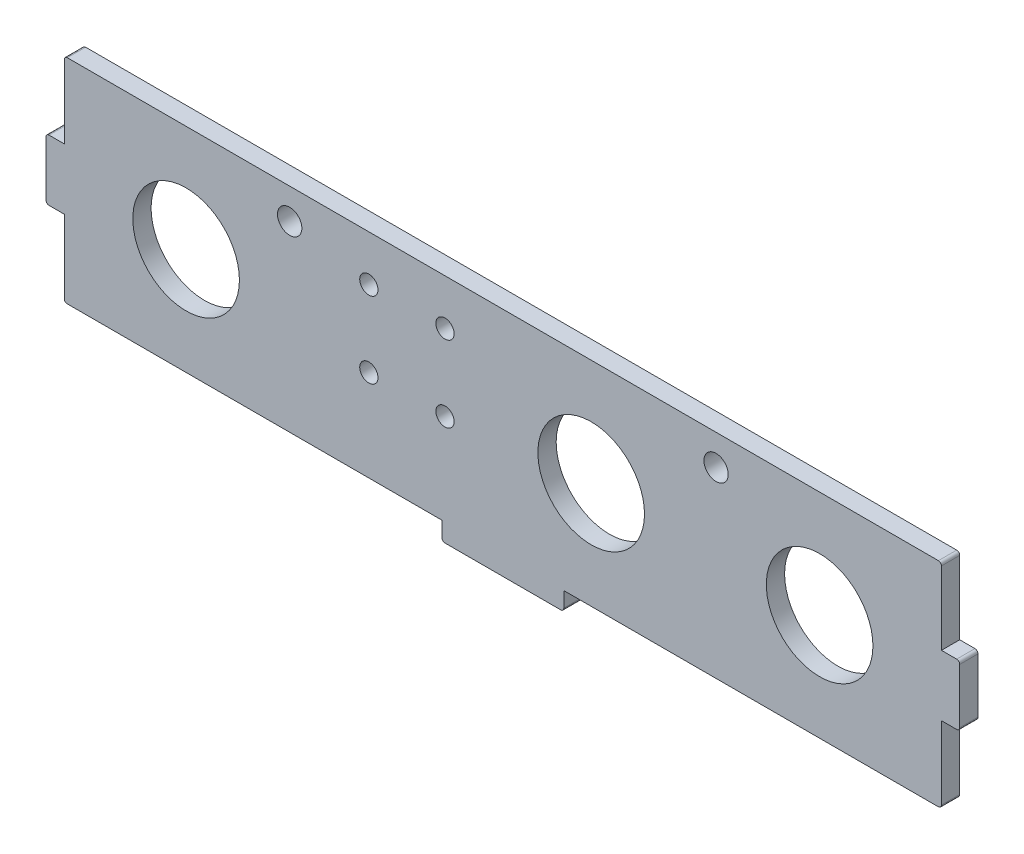
ISO-10303-21;
HEADER;
FILE_DESCRIPTION(('STEP AP214'),'2;1');
FILE_NAME('part.step','',(''),(''),'','','');
FILE_SCHEMA(('AUTOMOTIVE_DESIGN { 1 0 10303 214 1 1 1 1 }'));
ENDSEC;
DATA;
#1=APPLICATION_CONTEXT('core data for automotive mechanical design processes');
#2=APPLICATION_PROTOCOL_DEFINITION('international standard','automotive_design',2000,#1);
#3=PRODUCT_CONTEXT('',#1,'mechanical');
#4=PRODUCT('Part','Part','',(#3));
#5=PRODUCT_RELATED_PRODUCT_CATEGORY('part','',(#4));
#6=PRODUCT_DEFINITION_FORMATION('','',#4);
#7=PRODUCT_DEFINITION_CONTEXT('part definition',#1,'design');
#8=PRODUCT_DEFINITION('design','',#6,#7);
#9=PRODUCT_DEFINITION_SHAPE('','',#8);
#10=(LENGTH_UNIT() NAMED_UNIT(*) SI_UNIT(.MILLI.,.METRE.));
#11=(NAMED_UNIT(*) PLANE_ANGLE_UNIT() SI_UNIT($,.RADIAN.));
#12=(NAMED_UNIT(*) SI_UNIT($,.STERADIAN.) SOLID_ANGLE_UNIT());
#13=UNCERTAINTY_MEASURE_WITH_UNIT(LENGTH_MEASURE(1.E-05),#10,'distance_accuracy_value','');
#14=(GEOMETRIC_REPRESENTATION_CONTEXT(3) GLOBAL_UNCERTAINTY_ASSIGNED_CONTEXT((#13)) GLOBAL_UNIT_ASSIGNED_CONTEXT((#10,
#11,#12)) REPRESENTATION_CONTEXT('',''));
#15=CARTESIAN_POINT('',(0.,0.,0.));
#16=DIRECTION('',(0.,0.,1.));
#17=DIRECTION('',(1.,0.,0.));
#18=AXIS2_PLACEMENT_3D('',#15,#16,#17);
#19=CARTESIAN_POINT('',(0.,0.,-6.));
#20=DIRECTION('',(0.,-1.,0.));
#21=DIRECTION('',(0.,0.,-1.));
#22=AXIS2_PLACEMENT_3D('',#19,#20,#21);
#23=PLANE('',#22);
#24=DIRECTION('',(1.,0.,0.));
#25=VECTOR('',#24,1.);
#26=CARTESIAN_POINT('',(0.,0.,0.));
#27=LINE('',#26,#25);
#28=CARTESIAN_POINT('',(7.00000000000002,0.,0.));
#29=VERTEX_POINT('',#28);
#30=CARTESIAN_POINT('',(130.,0.,0.));
#31=VERTEX_POINT('',#30);
#32=EDGE_CURVE('E231',#29,#31,#27,.T.);
#33=ORIENTED_EDGE('',*,*,#32,.F.);
#34=DIRECTION('',(0.,0.,1.));
#35=VECTOR('',#34,1.);
#36=CARTESIAN_POINT('',(7.00000000000002,0.,-6.));
#37=LINE('',#36,#35);
#38=CARTESIAN_POINT('',(7.00000000000002,0.,-6.));
#39=VERTEX_POINT('',#38);
#40=EDGE_CURVE('E39',#29,#39,#37,.F.);
#41=ORIENTED_EDGE('',*,*,#40,.T.);
#42=DIRECTION('',(1.,0.,0.));
#43=VECTOR('',#42,1.);
#44=CARTESIAN_POINT('',(0.,0.,-6.));
#45=LINE('',#44,#43);
#46=CARTESIAN_POINT('',(130.,0.,-6.));
#47=VERTEX_POINT('',#46);
#48=EDGE_CURVE('E272',#39,#47,#45,.T.);
#49=ORIENTED_EDGE('',*,*,#48,.T.);
#50=DIRECTION('',(0.,0.,1.));
#51=VECTOR('',#50,1.);
#52=CARTESIAN_POINT('',(130.,0.,-46.4474968323134));
#53=LINE('',#52,#51);
#54=EDGE_CURVE('E225',#47,#31,#53,.T.);
#55=ORIENTED_EDGE('',*,*,#54,.T.);
#56=EDGE_LOOP('',(#33,#41,#49,#55));
#57=FACE_BOUND('',#56,.T.);
#58=ADVANCED_FACE('F31',(#57),#23,.T.);
#59=CARTESIAN_POINT('',(0.,0.,-6.));
#60=DIRECTION('',(-1.,0.,0.));
#61=DIRECTION('',(0.,0.,1.));
#62=AXIS2_PLACEMENT_3D('',#59,#60,#61);
#63=PLANE('',#62);
#64=DIRECTION('',(0.,-1.,0.));
#65=VECTOR('',#64,1.);
#66=CARTESIAN_POINT('',(0.,0.,-6.));
#67=LINE('',#66,#65);
#68=CARTESIAN_POINT('',(0.,44.,-6.));
#69=VERTEX_POINT('',#68);
#70=CARTESIAN_POINT('',(0.,26.,-6.));
#71=VERTEX_POINT('',#70);
#72=EDGE_CURVE('E276',#69,#71,#67,.T.);
#73=ORIENTED_EDGE('',*,*,#72,.T.);
#74=DIRECTION('',(0.,0.,1.));
#75=VECTOR('',#74,1.);
#76=CARTESIAN_POINT('',(0.,26.,-6.));
#77=LINE('',#76,#75);
#78=CARTESIAN_POINT('',(0.,26.,0.));
#79=VERTEX_POINT('',#78);
#80=EDGE_CURVE('E307',#71,#79,#77,.T.);
#81=ORIENTED_EDGE('',*,*,#80,.T.);
#82=DIRECTION('',(0.,-1.,0.));
#83=VECTOR('',#82,1.);
#84=CARTESIAN_POINT('',(0.,0.,0.));
#85=LINE('',#84,#83);
#86=CARTESIAN_POINT('',(0.,44.,0.));
#87=VERTEX_POINT('',#86);
#88=EDGE_CURVE('E232',#87,#79,#85,.T.);
#89=ORIENTED_EDGE('',*,*,#88,.F.);
#90=DIRECTION('',(0.,0.,1.));
#91=VECTOR('',#90,1.);
#92=CARTESIAN_POINT('',(0.,44.,-6.));
#93=LINE('',#92,#91);
#94=EDGE_CURVE('E305',#87,#69,#93,.F.);
#95=ORIENTED_EDGE('',*,*,#94,.T.);
#96=EDGE_LOOP('',(#73,#81,#89,#95));
#97=FACE_BOUND('',#96,.T.);
#98=ADVANCED_FACE('F476',(#97),#63,.T.);
#99=CARTESIAN_POINT('',(0.,70.,-6.));
#100=DIRECTION('',(0.,0.,-1.));
#101=DIRECTION('',(-1.,0.,0.));
#102=AXIS2_PLACEMENT_3D('',#99,#100,#101);
#103=PLANE('',#102);
#104=CARTESIAN_POINT('',(254.,35.,-6.));
#105=DIRECTION('',(0.,0.,-1.));
#106=DIRECTION('',(-1.,0.,0.));
#107=AXIS2_PLACEMENT_3D('',#104,#105,#106);
#108=CIRCLE('',#107,17.5);
#109=CARTESIAN_POINT('',(236.5,35.,-6.));
#110=VERTEX_POINT('',#109);
#111=EDGE_CURVE('E601',#110,#110,#108,.F.);
#112=ORIENTED_EDGE('',*,*,#111,.T.);
#113=EDGE_LOOP('',(#112));
#114=FACE_BOUND('',#113,.T.);
#115=CARTESIAN_POINT('',(179.,35.,-6.));
#116=DIRECTION('',(0.,0.,-1.));
#117=DIRECTION('',(-1.,0.,0.));
#118=AXIS2_PLACEMENT_3D('',#115,#116,#117);
#119=CIRCLE('',#118,17.5);
#120=CARTESIAN_POINT('',(161.5,35.,-6.));
#121=VERTEX_POINT('',#120);
#122=EDGE_CURVE('E605',#121,#121,#119,.F.);
#123=ORIENTED_EDGE('',*,*,#122,.T.);
#124=EDGE_LOOP('',(#123));
#125=FACE_BOUND('',#124,.T.);
#126=CARTESIAN_POINT('',(46.,35.,-6.));
#127=DIRECTION('',(0.,0.,-1.));
#128=DIRECTION('',(-1.,0.,0.));
#129=AXIS2_PLACEMENT_3D('',#126,#127,#128);
#130=CIRCLE('',#129,17.5);
#131=CARTESIAN_POINT('',(28.5,35.,-6.));
#132=VERTEX_POINT('',#131);
#133=EDGE_CURVE('E613',#132,#132,#130,.F.);
#134=ORIENTED_EDGE('',*,*,#133,.T.);
#135=EDGE_LOOP('',(#134));
#136=FACE_BOUND('',#135,.T.);
#137=CARTESIAN_POINT('',(131.,30.,-6.));
#138=DIRECTION('',(0.,0.,-1.));
#139=DIRECTION('',(-1.,0.,0.));
#140=AXIS2_PLACEMENT_3D('',#137,#138,#139);
#141=CIRCLE('',#140,2.99999999999999);
#142=CARTESIAN_POINT('',(128.,30.,-6.));
#143=VERTEX_POINT('',#142);
#144=EDGE_CURVE('E623',#143,#143,#141,.T.);
#145=ORIENTED_EDGE('',*,*,#144,.F.);
#146=EDGE_LOOP('',(#145));
#147=FACE_BOUND('',#146,.T.);
#148=CARTESIAN_POINT('',(106.,30.,-6.));
#149=DIRECTION('',(0.,0.,-1.));
#150=DIRECTION('',(-1.,0.,0.));
#151=AXIS2_PLACEMENT_3D('',#148,#149,#150);
#152=CIRCLE('',#151,3.00000000000001);
#153=CARTESIAN_POINT('',(103.,30.,-6.));
#154=VERTEX_POINT('',#153);
#155=EDGE_CURVE('E629',#154,#154,#152,.T.);
#156=ORIENTED_EDGE('',*,*,#155,.F.);
#157=EDGE_LOOP('',(#156));
#158=FACE_BOUND('',#157,.T.);
#159=CARTESIAN_POINT('',(131.,55.,-6.));
#160=DIRECTION('',(0.,0.,-1.));
#161=DIRECTION('',(-1.,0.,0.));
#162=AXIS2_PLACEMENT_3D('',#159,#160,#161);
#163=CIRCLE('',#162,2.99999999999999);
#164=CARTESIAN_POINT('',(128.,55.,-6.));
#165=VERTEX_POINT('',#164);
#166=EDGE_CURVE('E635',#165,#165,#163,.T.);
#167=ORIENTED_EDGE('',*,*,#166,.F.);
#168=EDGE_LOOP('',(#167));
#169=FACE_BOUND('',#168,.T.);
#170=CARTESIAN_POINT('',(106.,55.,-6.));
#171=DIRECTION('',(0.,0.,-1.));
#172=DIRECTION('',(-1.,0.,0.));
#173=AXIS2_PLACEMENT_3D('',#170,#171,#172);
#174=CIRCLE('',#173,3.00000000000001);
#175=CARTESIAN_POINT('',(103.,55.,-6.));
#176=VERTEX_POINT('',#175);
#177=EDGE_CURVE('E641',#176,#176,#174,.T.);
#178=ORIENTED_EDGE('',*,*,#177,.F.);
#179=EDGE_LOOP('',(#178));
#180=FACE_BOUND('',#179,.T.);
#181=CARTESIAN_POINT('',(220.,60.,-6.));
#182=DIRECTION('',(0.,0.,1.));
#183=DIRECTION('',(1.,0.,0.));
#184=AXIS2_PLACEMENT_3D('',#181,#182,#183);
#185=CIRCLE('',#184,3.99999999999999);
#186=CARTESIAN_POINT('',(224.,60.,-6.));
#187=VERTEX_POINT('',#186);
#188=EDGE_CURVE('E657',#187,#187,#185,.T.);
#189=ORIENTED_EDGE('',*,*,#188,.T.);
#190=EDGE_LOOP('',(#189));
#191=FACE_BOUND('',#190,.T.);
#192=CARTESIAN_POINT('',(80.,60.,-6.));
#193=DIRECTION('',(0.,0.,1.));
#194=DIRECTION('',(1.,0.,0.));
#195=AXIS2_PLACEMENT_3D('',#192,#193,#194);
#196=CIRCLE('',#195,4.00000000000001);
#197=CARTESIAN_POINT('',(84.,60.,-6.));
#198=VERTEX_POINT('',#197);
#199=EDGE_CURVE('E666',#198,#198,#196,.T.);
#200=ORIENTED_EDGE('',*,*,#199,.T.);
#201=EDGE_LOOP('',(#200));
#202=FACE_BOUND('',#201,.T.);
#203=DIRECTION('',(1.,0.,0.));
#204=VECTOR('',#203,1.);
#205=CARTESIAN_POINT('',(294.,45.,-6.));
#206=LINE('',#205,#204);
#207=CARTESIAN_POINT('',(294.,45.,-6.));
#208=VERTEX_POINT('',#207);
#209=CARTESIAN_POINT('',(299.,45.,-6.));
#210=VERTEX_POINT('',#209);
#211=EDGE_CURVE('E426',#208,#210,#206,.T.);
#212=ORIENTED_EDGE('',*,*,#211,.T.);
#213=CARTESIAN_POINT('',(299.,44.,-6.));
#214=DIRECTION('',(0.,0.,-1.));
#215=DIRECTION('',(-1.,0.,0.));
#216=AXIS2_PLACEMENT_3D('',#213,#214,#215);
#217=CIRCLE('',#216,1.);
#218=CARTESIAN_POINT('',(300.,44.,-6.));
#219=VERTEX_POINT('',#218);
#220=EDGE_CURVE('E300',#210,#219,#217,.T.);
#221=ORIENTED_EDGE('',*,*,#220,.T.);
#222=DIRECTION('',(0.,1.,0.));
#223=VECTOR('',#222,1.);
#224=CARTESIAN_POINT('',(300.,0.,-6.));
#225=LINE('',#224,#223);
#226=CARTESIAN_POINT('',(300.,26.,-6.));
#227=VERTEX_POINT('',#226);
#228=EDGE_CURVE('E268',#227,#219,#225,.T.);
#229=ORIENTED_EDGE('',*,*,#228,.F.);
#230=CARTESIAN_POINT('',(299.,26.,-6.));
#231=DIRECTION('',(0.,0.,-1.));
#232=DIRECTION('',(-1.,0.,0.));
#233=AXIS2_PLACEMENT_3D('',#230,#231,#232);
#234=CIRCLE('',#233,1.);
#235=CARTESIAN_POINT('',(299.,25.,-6.));
#236=VERTEX_POINT('',#235);
#237=EDGE_CURVE('E46',#227,#236,#234,.T.);
#238=ORIENTED_EDGE('',*,*,#237,.T.);
#239=DIRECTION('',(-1.,0.,0.));
#240=VECTOR('',#239,1.);
#241=CARTESIAN_POINT('',(300.,25.,-6.));
#242=LINE('',#241,#240);
#243=CARTESIAN_POINT('',(294.,25.,-6.));
#244=VERTEX_POINT('',#243);
#245=EDGE_CURVE('E456',#236,#244,#242,.T.);
#246=ORIENTED_EDGE('',*,*,#245,.T.);
#247=DIRECTION('',(0.,-1.,0.));
#248=VECTOR('',#247,1.);
#249=CARTESIAN_POINT('',(294.,25.,-6.));
#250=LINE('',#249,#248);
#251=CARTESIAN_POINT('',(294.,1.,-6.));
#252=VERTEX_POINT('',#251);
#253=EDGE_CURVE('E460',#244,#252,#250,.T.);
#254=ORIENTED_EDGE('',*,*,#253,.T.);
#255=CARTESIAN_POINT('',(293.,1.,-6.));
#256=DIRECTION('',(0.,0.,-1.));
#257=DIRECTION('',(-1.,0.,0.));
#258=AXIS2_PLACEMENT_3D('',#255,#256,#257);
#259=CIRCLE('',#258,1.);
#260=CARTESIAN_POINT('',(293.,0.,-6.));
#261=VERTEX_POINT('',#260);
#262=EDGE_CURVE('E289',#252,#261,#259,.T.);
#263=ORIENTED_EDGE('',*,*,#262,.T.);
#264=CARTESIAN_POINT('',(170.,0.,-6.));
#265=VERTEX_POINT('',#264);
#266=EDGE_CURVE('E244',#265,#261,#45,.T.);
#267=ORIENTED_EDGE('',*,*,#266,.F.);
#268=DIRECTION('',(0.,1.,0.));
#269=VECTOR('',#268,1.);
#270=CARTESIAN_POINT('',(170.,0.,-6.));
#271=LINE('',#270,#269);
#272=CARTESIAN_POINT('',(170.,-5.,-6.));
#273=VERTEX_POINT('',#272);
#274=EDGE_CURVE('E221',#273,#265,#271,.T.);
#275=ORIENTED_EDGE('',*,*,#274,.F.);
#276=CARTESIAN_POINT('',(169.,-5.,-6.));
#277=DIRECTION('',(0.,0.,-1.));
#278=DIRECTION('',(-1.,0.,0.));
#279=AXIS2_PLACEMENT_3D('',#276,#277,#278);
#280=CIRCLE('',#279,1.);
#281=CARTESIAN_POINT('',(169.,-6.,-6.));
#282=VERTEX_POINT('',#281);
#283=EDGE_CURVE('E293',#273,#282,#280,.T.);
#284=ORIENTED_EDGE('',*,*,#283,.T.);
#285=DIRECTION('',(1.,0.,0.));
#286=VECTOR('',#285,1.);
#287=CARTESIAN_POINT('',(130.,-6.,-6.));
#288=LINE('',#287,#286);
#289=CARTESIAN_POINT('',(131.,-6.,-6.));
#290=VERTEX_POINT('',#289);
#291=EDGE_CURVE('E214',#290,#282,#288,.T.);
#292=ORIENTED_EDGE('',*,*,#291,.F.);
#293=CARTESIAN_POINT('',(131.,-5.,-6.));
#294=DIRECTION('',(0.,0.,-1.));
#295=DIRECTION('',(-1.,0.,0.));
#296=AXIS2_PLACEMENT_3D('',#293,#294,#295);
#297=CIRCLE('',#296,1.);
#298=CARTESIAN_POINT('',(130.,-5.,-6.));
#299=VERTEX_POINT('',#298);
#300=EDGE_CURVE('E291',#290,#299,#297,.T.);
#301=ORIENTED_EDGE('',*,*,#300,.T.);
#302=DIRECTION('',(0.,-1.,0.));
#303=VECTOR('',#302,1.);
#304=CARTESIAN_POINT('',(130.,0.,-6.));
#305=LINE('',#304,#303);
#306=EDGE_CURVE('E350',#47,#299,#305,.T.);
#307=ORIENTED_EDGE('',*,*,#306,.F.);
#308=ORIENTED_EDGE('',*,*,#48,.F.);
#309=CARTESIAN_POINT('',(7.00000000000002,1.,-6.));
#310=DIRECTION('',(0.,0.,-1.));
#311=DIRECTION('',(-1.,0.,0.));
#312=AXIS2_PLACEMENT_3D('',#309,#310,#311);
#313=CIRCLE('',#312,1.);
#314=CARTESIAN_POINT('',(6.00000000000002,1.,-6.));
#315=VERTEX_POINT('',#314);
#316=EDGE_CURVE('E285',#39,#315,#313,.T.);
#317=ORIENTED_EDGE('',*,*,#316,.T.);
#318=DIRECTION('',(0.,-1.,0.));
#319=VECTOR('',#318,1.);
#320=CARTESIAN_POINT('',(6.00000000000003,-204.754651374949,-6.));
#321=LINE('',#320,#319);
#322=CARTESIAN_POINT('',(6.00000000000001,25.,-6.));
#323=VERTEX_POINT('',#322);
#324=EDGE_CURVE('E361',#323,#315,#321,.T.);
#325=ORIENTED_EDGE('',*,*,#324,.F.);
#326=DIRECTION('',(1.,0.,0.));
#327=VECTOR('',#326,1.);
#328=CARTESIAN_POINT('',(150.,25.,-6.));
#329=LINE('',#328,#327);
#330=CARTESIAN_POINT('',(1.,25.,-6.));
#331=VERTEX_POINT('',#330);
#332=EDGE_CURVE('E373',#331,#323,#329,.T.);
#333=ORIENTED_EDGE('',*,*,#332,.F.);
#334=CARTESIAN_POINT('',(1.,26.,-6.));
#335=DIRECTION('',(0.,0.,-1.));
#336=DIRECTION('',(-1.,0.,0.));
#337=AXIS2_PLACEMENT_3D('',#334,#335,#336);
#338=CIRCLE('',#337,1.);
#339=EDGE_CURVE('E297',#331,#71,#338,.T.);
#340=ORIENTED_EDGE('',*,*,#339,.T.);
#341=ORIENTED_EDGE('',*,*,#72,.F.);
#342=CARTESIAN_POINT('',(1.,44.,-6.));
#343=DIRECTION('',(0.,0.,-1.));
#344=DIRECTION('',(-1.,0.,0.));
#345=AXIS2_PLACEMENT_3D('',#342,#343,#344);
#346=CIRCLE('',#345,1.);
#347=CARTESIAN_POINT('',(1.,45.,-6.));
#348=VERTEX_POINT('',#347);
#349=EDGE_CURVE('E295',#69,#348,#346,.T.);
#350=ORIENTED_EDGE('',*,*,#349,.T.);
#351=DIRECTION('',(-1.,0.,0.));
#352=VECTOR('',#351,1.);
#353=CARTESIAN_POINT('',(150.,45.,-6.));
#354=LINE('',#353,#352);
#355=CARTESIAN_POINT('',(6.,45.,-6.));
#356=VERTEX_POINT('',#355);
#357=EDGE_CURVE('E377',#356,#348,#354,.T.);
#358=ORIENTED_EDGE('',*,*,#357,.F.);
#359=DIRECTION('',(0.,-1.,0.));
#360=VECTOR('',#359,1.);
#361=CARTESIAN_POINT('',(5.99999999999995,-204.754651374949,-6.));
#362=LINE('',#361,#360);
#363=CARTESIAN_POINT('',(6.00000000000001,69.,-6.));
#364=VERTEX_POINT('',#363);
#365=EDGE_CURVE('E380',#364,#356,#362,.T.);
#366=ORIENTED_EDGE('',*,*,#365,.F.);
#367=CARTESIAN_POINT('',(7.00000000000001,69.,-6.));
#368=DIRECTION('',(0.,0.,-1.));
#369=DIRECTION('',(-1.,0.,0.));
#370=AXIS2_PLACEMENT_3D('',#367,#368,#369);
#371=CIRCLE('',#370,1.);
#372=CARTESIAN_POINT('',(7.00000000000001,70.,-6.));
#373=VERTEX_POINT('',#372);
#374=EDGE_CURVE('E283',#364,#373,#371,.T.);
#375=ORIENTED_EDGE('',*,*,#374,.T.);
#376=DIRECTION('',(-1.,0.,0.));
#377=VECTOR('',#376,1.);
#378=CARTESIAN_POINT('',(0.,70.,-6.));
#379=LINE('',#378,#377);
#380=CARTESIAN_POINT('',(293.,70.,-6.));
#381=VERTEX_POINT('',#380);
#382=EDGE_CURVE('E261',#381,#373,#379,.T.);
#383=ORIENTED_EDGE('',*,*,#382,.F.);
#384=CARTESIAN_POINT('',(293.,69.,-6.));
#385=DIRECTION('',(0.,0.,-1.));
#386=DIRECTION('',(-1.,0.,0.));
#387=AXIS2_PLACEMENT_3D('',#384,#385,#386);
#388=CIRCLE('',#387,1.);
#389=CARTESIAN_POINT('',(294.,69.,-6.));
#390=VERTEX_POINT('',#389);
#391=EDGE_CURVE('E53',#381,#390,#388,.T.);
#392=ORIENTED_EDGE('',*,*,#391,.T.);
#393=DIRECTION('',(0.,-1.,0.));
#394=VECTOR('',#393,1.);
#395=CARTESIAN_POINT('',(294.,70.,-6.));
#396=LINE('',#395,#394);
#397=EDGE_CURVE('E431',#390,#208,#396,.T.);
#398=ORIENTED_EDGE('',*,*,#397,.T.);
#399=EDGE_LOOP('',(#212,#221,#229,#238,#246,#254,#263,#267,#275,#284,#292,#301,#307,#308,#317,
#325,#333,#340,#341,#350,#358,#366,#375,#383,#392,#398));
#400=FACE_BOUND('',#399,.T.);
#401=ADVANCED_FACE('F346',(#114,#125,#136,#147,#158,#169,#180,#191,#202,#400),#103,.T.);
#402=CARTESIAN_POINT('',(0.,70.,0.));
#403=DIRECTION('',(0.,0.,-1.));
#404=DIRECTION('',(-1.,0.,0.));
#405=AXIS2_PLACEMENT_3D('',#402,#403,#404);
#406=PLANE('',#405);
#407=CARTESIAN_POINT('',(254.,35.,0.));
#408=DIRECTION('',(0.,0.,1.));
#409=DIRECTION('',(1.,0.,0.));
#410=AXIS2_PLACEMENT_3D('',#407,#408,#409);
#411=CIRCLE('',#410,17.5);
#412=CARTESIAN_POINT('',(271.5,35.,0.));
#413=VERTEX_POINT('',#412);
#414=EDGE_CURVE('E604',#413,#413,#411,.T.);
#415=ORIENTED_EDGE('',*,*,#414,.F.);
#416=EDGE_LOOP('',(#415));
#417=FACE_BOUND('',#416,.T.);
#418=CARTESIAN_POINT('',(179.,35.,0.));
#419=DIRECTION('',(0.,0.,1.));
#420=DIRECTION('',(1.,0.,0.));
#421=AXIS2_PLACEMENT_3D('',#418,#419,#420);
#422=CIRCLE('',#421,17.5);
#423=CARTESIAN_POINT('',(196.5,35.,0.));
#424=VERTEX_POINT('',#423);
#425=EDGE_CURVE('E608',#424,#424,#422,.T.);
#426=ORIENTED_EDGE('',*,*,#425,.F.);
#427=EDGE_LOOP('',(#426));
#428=FACE_BOUND('',#427,.T.);
#429=CARTESIAN_POINT('',(46.,35.,0.));
#430=DIRECTION('',(0.,0.,1.));
#431=DIRECTION('',(1.,0.,0.));
#432=AXIS2_PLACEMENT_3D('',#429,#430,#431);
#433=CIRCLE('',#432,17.5);
#434=CARTESIAN_POINT('',(63.5,35.,0.));
#435=VERTEX_POINT('',#434);
#436=EDGE_CURVE('E615',#435,#435,#433,.T.);
#437=ORIENTED_EDGE('',*,*,#436,.F.);
#438=EDGE_LOOP('',(#437));
#439=FACE_BOUND('',#438,.T.);
#440=CARTESIAN_POINT('',(131.,30.,0.));
#441=DIRECTION('',(0.,0.,1.));
#442=DIRECTION('',(1.,0.,0.));
#443=AXIS2_PLACEMENT_3D('',#440,#441,#442);
#444=CIRCLE('',#443,2.99999999999999);
#445=CARTESIAN_POINT('',(134.,30.,0.));
#446=VERTEX_POINT('',#445);
#447=EDGE_CURVE('E618',#446,#446,#444,.T.);
#448=ORIENTED_EDGE('',*,*,#447,.F.);
#449=EDGE_LOOP('',(#448));
#450=FACE_BOUND('',#449,.T.);
#451=CARTESIAN_POINT('',(106.,30.,0.));
#452=DIRECTION('',(0.,0.,1.));
#453=DIRECTION('',(1.,0.,0.));
#454=AXIS2_PLACEMENT_3D('',#451,#452,#453);
#455=CIRCLE('',#454,3.00000000000001);
#456=CARTESIAN_POINT('',(109.,30.,0.));
#457=VERTEX_POINT('',#456);
#458=EDGE_CURVE('E626',#457,#457,#455,.T.);
#459=ORIENTED_EDGE('',*,*,#458,.F.);
#460=EDGE_LOOP('',(#459));
#461=FACE_BOUND('',#460,.T.);
#462=CARTESIAN_POINT('',(131.,55.,0.));
#463=DIRECTION('',(0.,0.,1.));
#464=DIRECTION('',(1.,0.,0.));
#465=AXIS2_PLACEMENT_3D('',#462,#463,#464);
#466=CIRCLE('',#465,2.99999999999999);
#467=CARTESIAN_POINT('',(134.,55.,0.));
#468=VERTEX_POINT('',#467);
#469=EDGE_CURVE('E632',#468,#468,#466,.T.);
#470=ORIENTED_EDGE('',*,*,#469,.F.);
#471=EDGE_LOOP('',(#470));
#472=FACE_BOUND('',#471,.T.);
#473=CARTESIAN_POINT('',(106.,55.,0.));
#474=DIRECTION('',(0.,0.,1.));
#475=DIRECTION('',(1.,0.,0.));
#476=AXIS2_PLACEMENT_3D('',#473,#474,#475);
#477=CIRCLE('',#476,3.00000000000001);
#478=CARTESIAN_POINT('',(109.,55.,0.));
#479=VERTEX_POINT('',#478);
#480=EDGE_CURVE('E638',#479,#479,#477,.T.);
#481=ORIENTED_EDGE('',*,*,#480,.F.);
#482=EDGE_LOOP('',(#481));
#483=FACE_BOUND('',#482,.T.);
#484=CARTESIAN_POINT('',(220.,60.,0.));
#485=DIRECTION('',(0.,0.,1.));
#486=DIRECTION('',(1.,0.,0.));
#487=AXIS2_PLACEMENT_3D('',#484,#485,#486);
#488=CIRCLE('',#487,3.99999999999999);
#489=CARTESIAN_POINT('',(224.,60.,0.));
#490=VERTEX_POINT('',#489);
#491=EDGE_CURVE('E661',#490,#490,#488,.T.);
#492=ORIENTED_EDGE('',*,*,#491,.F.);
#493=EDGE_LOOP('',(#492));
#494=FACE_BOUND('',#493,.T.);
#495=CARTESIAN_POINT('',(80.,60.,0.));
#496=DIRECTION('',(0.,0.,1.));
#497=DIRECTION('',(1.,0.,0.));
#498=AXIS2_PLACEMENT_3D('',#495,#496,#497);
#499=CIRCLE('',#498,4.00000000000001);
#500=CARTESIAN_POINT('',(84.,60.,0.));
#501=VERTEX_POINT('',#500);
#502=EDGE_CURVE('E668',#501,#501,#499,.T.);
#503=ORIENTED_EDGE('',*,*,#502,.F.);
#504=EDGE_LOOP('',(#503));
#505=FACE_BOUND('',#504,.T.);
#506=DIRECTION('',(0.,1.,0.));
#507=VECTOR('',#506,1.);
#508=CARTESIAN_POINT('',(300.,0.,0.));
#509=LINE('',#508,#507);
#510=CARTESIAN_POINT('',(300.,26.,0.));
#511=VERTEX_POINT('',#510);
#512=CARTESIAN_POINT('',(300.,44.,0.));
#513=VERTEX_POINT('',#512);
#514=EDGE_CURVE('E234',#511,#513,#509,.T.);
#515=ORIENTED_EDGE('',*,*,#514,.T.);
#516=CARTESIAN_POINT('',(299.,44.,0.));
#517=DIRECTION('',(0.,0.,-1.));
#518=DIRECTION('',(-1.,0.,0.));
#519=AXIS2_PLACEMENT_3D('',#516,#517,#518);
#520=CIRCLE('',#519,1.);
#521=CARTESIAN_POINT('',(299.,45.,0.));
#522=VERTEX_POINT('',#521);
#523=EDGE_CURVE('E419',#513,#522,#520,.F.);
#524=ORIENTED_EDGE('',*,*,#523,.T.);
#525=DIRECTION('',(1.,0.,0.));
#526=VECTOR('',#525,1.);
#527=CARTESIAN_POINT('',(294.,45.,0.));
#528=LINE('',#527,#526);
#529=CARTESIAN_POINT('',(294.,45.,0.));
#530=VERTEX_POINT('',#529);
#531=EDGE_CURVE('E428',#530,#522,#528,.T.);
#532=ORIENTED_EDGE('',*,*,#531,.F.);
#533=DIRECTION('',(0.,-1.,0.));
#534=VECTOR('',#533,1.);
#535=CARTESIAN_POINT('',(294.,70.,0.));
#536=LINE('',#535,#534);
#537=CARTESIAN_POINT('',(294.,69.,0.));
#538=VERTEX_POINT('',#537);
#539=EDGE_CURVE('E433',#538,#530,#536,.T.);
#540=ORIENTED_EDGE('',*,*,#539,.F.);
#541=CARTESIAN_POINT('',(293.,69.,0.));
#542=DIRECTION('',(0.,0.,-1.));
#543=DIRECTION('',(-1.,0.,0.));
#544=AXIS2_PLACEMENT_3D('',#541,#542,#543);
#545=CIRCLE('',#544,1.);
#546=CARTESIAN_POINT('',(293.,70.,0.));
#547=VERTEX_POINT('',#546);
#548=EDGE_CURVE('E406',#538,#547,#545,.F.);
#549=ORIENTED_EDGE('',*,*,#548,.T.);
#550=DIRECTION('',(-1.,0.,0.));
#551=VECTOR('',#550,1.);
#552=CARTESIAN_POINT('',(0.,70.,0.));
#553=LINE('',#552,#551);
#554=CARTESIAN_POINT('',(7.00000000000001,70.,0.));
#555=VERTEX_POINT('',#554);
#556=EDGE_CURVE('E242',#547,#555,#553,.T.);
#557=ORIENTED_EDGE('',*,*,#556,.T.);
#558=CARTESIAN_POINT('',(7.00000000000001,69.,0.));
#559=DIRECTION('',(0.,0.,-1.));
#560=DIRECTION('',(-1.,0.,0.));
#561=AXIS2_PLACEMENT_3D('',#558,#559,#560);
#562=CIRCLE('',#561,1.);
#563=CARTESIAN_POINT('',(6.00000000000001,69.,0.));
#564=VERTEX_POINT('',#563);
#565=EDGE_CURVE('E255',#555,#564,#562,.F.);
#566=ORIENTED_EDGE('',*,*,#565,.T.);
#567=DIRECTION('',(0.,-1.,0.));
#568=VECTOR('',#567,1.);
#569=CARTESIAN_POINT('',(5.99999999999995,-204.754651374949,0.));
#570=LINE('',#569,#568);
#571=CARTESIAN_POINT('',(6.,45.,0.));
#572=VERTEX_POINT('',#571);
#573=EDGE_CURVE('E368',#564,#572,#570,.T.);
#574=ORIENTED_EDGE('',*,*,#573,.T.);
#575=DIRECTION('',(-1.,0.,0.));
#576=VECTOR('',#575,1.);
#577=CARTESIAN_POINT('',(150.,45.,0.));
#578=LINE('',#577,#576);
#579=CARTESIAN_POINT('',(1.,45.,0.));
#580=VERTEX_POINT('',#579);
#581=EDGE_CURVE('E365',#572,#580,#578,.T.);
#582=ORIENTED_EDGE('',*,*,#581,.T.);
#583=CARTESIAN_POINT('',(1.,44.,0.));
#584=DIRECTION('',(0.,0.,-1.));
#585=DIRECTION('',(-1.,0.,0.));
#586=AXIS2_PLACEMENT_3D('',#583,#584,#585);
#587=CIRCLE('',#586,1.);
#588=EDGE_CURVE('E401',#580,#87,#587,.F.);
#589=ORIENTED_EDGE('',*,*,#588,.T.);
#590=ORIENTED_EDGE('',*,*,#88,.T.);
#591=CARTESIAN_POINT('',(1.,26.,0.));
#592=DIRECTION('',(0.,0.,-1.));
#593=DIRECTION('',(-1.,0.,0.));
#594=AXIS2_PLACEMENT_3D('',#591,#592,#593);
#595=CIRCLE('',#594,1.);
#596=CARTESIAN_POINT('',(1.,25.,0.));
#597=VERTEX_POINT('',#596);
#598=EDGE_CURVE('E415',#79,#597,#595,.F.);
#599=ORIENTED_EDGE('',*,*,#598,.T.);
#600=DIRECTION('',(1.,0.,0.));
#601=VECTOR('',#600,1.);
#602=CARTESIAN_POINT('',(150.,25.,0.));
#603=LINE('',#602,#601);
#604=CARTESIAN_POINT('',(6.00000000000001,25.,0.));
#605=VERTEX_POINT('',#604);
#606=EDGE_CURVE('E363',#597,#605,#603,.T.);
#607=ORIENTED_EDGE('',*,*,#606,.T.);
#608=DIRECTION('',(0.,-1.,0.));
#609=VECTOR('',#608,1.);
#610=CARTESIAN_POINT('',(6.00000000000003,-204.754651374949,0.));
#611=LINE('',#610,#609);
#612=CARTESIAN_POINT('',(6.00000000000002,1.,0.));
#613=VERTEX_POINT('',#612);
#614=EDGE_CURVE('E360',#605,#613,#611,.T.);
#615=ORIENTED_EDGE('',*,*,#614,.T.);
#616=CARTESIAN_POINT('',(7.00000000000002,1.,0.));
#617=DIRECTION('',(0.,0.,-1.));
#618=DIRECTION('',(-1.,0.,0.));
#619=AXIS2_PLACEMENT_3D('',#616,#617,#618);
#620=CIRCLE('',#619,1.);
#621=EDGE_CURVE('E354',#613,#29,#620,.F.);
#622=ORIENTED_EDGE('',*,*,#621,.T.);
#623=ORIENTED_EDGE('',*,*,#32,.T.);
#624=DIRECTION('',(0.,-1.,0.));
#625=VECTOR('',#624,1.);
#626=CARTESIAN_POINT('',(130.,0.,0.));
#627=LINE('',#626,#625);
#628=CARTESIAN_POINT('',(130.,-5.,0.));
#629=VERTEX_POINT('',#628);
#630=EDGE_CURVE('E644',#31,#629,#627,.T.);
#631=ORIENTED_EDGE('',*,*,#630,.T.);
#632=CARTESIAN_POINT('',(131.,-5.,0.));
#633=DIRECTION('',(0.,0.,-1.));
#634=DIRECTION('',(-1.,0.,0.));
#635=AXIS2_PLACEMENT_3D('',#632,#633,#634);
#636=CIRCLE('',#635,1.);
#637=CARTESIAN_POINT('',(131.,-6.,0.));
#638=VERTEX_POINT('',#637);
#639=EDGE_CURVE('E411',#629,#638,#636,.F.);
#640=ORIENTED_EDGE('',*,*,#639,.T.);
#641=DIRECTION('',(1.,0.,0.));
#642=VECTOR('',#641,1.);
#643=CARTESIAN_POINT('',(130.,-6.,0.));
#644=LINE('',#643,#642);
#645=CARTESIAN_POINT('',(169.,-6.,0.));
#646=VERTEX_POINT('',#645);
#647=EDGE_CURVE('E215',#638,#646,#644,.T.);
#648=ORIENTED_EDGE('',*,*,#647,.T.);
#649=CARTESIAN_POINT('',(169.,-5.,0.));
#650=DIRECTION('',(0.,0.,-1.));
#651=DIRECTION('',(-1.,0.,0.));
#652=AXIS2_PLACEMENT_3D('',#649,#650,#651);
#653=CIRCLE('',#652,1.);
#654=CARTESIAN_POINT('',(170.,-5.,0.));
#655=VERTEX_POINT('',#654);
#656=EDGE_CURVE('E211',#646,#655,#653,.F.);
#657=ORIENTED_EDGE('',*,*,#656,.T.);
#658=DIRECTION('',(0.,1.,0.));
#659=VECTOR('',#658,1.);
#660=CARTESIAN_POINT('',(170.,0.,0.));
#661=LINE('',#660,#659);
#662=CARTESIAN_POINT('',(170.,0.,0.));
#663=VERTEX_POINT('',#662);
#664=EDGE_CURVE('E204',#655,#663,#661,.T.);
#665=ORIENTED_EDGE('',*,*,#664,.T.);
#666=CARTESIAN_POINT('',(293.,0.,0.));
#667=VERTEX_POINT('',#666);
#668=EDGE_CURVE('E209',#663,#667,#27,.T.);
#669=ORIENTED_EDGE('',*,*,#668,.T.);
#670=CARTESIAN_POINT('',(293.,1.,0.));
#671=DIRECTION('',(0.,0.,-1.));
#672=DIRECTION('',(-1.,0.,0.));
#673=AXIS2_PLACEMENT_3D('',#670,#671,#672);
#674=CIRCLE('',#673,1.);
#675=CARTESIAN_POINT('',(294.,1.,0.));
#676=VERTEX_POINT('',#675);
#677=EDGE_CURVE('E407',#667,#676,#674,.F.);
#678=ORIENTED_EDGE('',*,*,#677,.T.);
#679=DIRECTION('',(0.,-1.,0.));
#680=VECTOR('',#679,1.);
#681=CARTESIAN_POINT('',(294.,25.,0.));
#682=LINE('',#681,#680);
#683=CARTESIAN_POINT('',(294.,25.,0.));
#684=VERTEX_POINT('',#683);
#685=EDGE_CURVE('E447',#684,#676,#682,.T.);
#686=ORIENTED_EDGE('',*,*,#685,.F.);
#687=DIRECTION('',(-1.,0.,0.));
#688=VECTOR('',#687,1.);
#689=CARTESIAN_POINT('',(300.,25.,0.));
#690=LINE('',#689,#688);
#691=CARTESIAN_POINT('',(299.,25.,0.));
#692=VERTEX_POINT('',#691);
#693=EDGE_CURVE('E455',#692,#684,#690,.T.);
#694=ORIENTED_EDGE('',*,*,#693,.F.);
#695=CARTESIAN_POINT('',(299.,26.,0.));
#696=DIRECTION('',(0.,0.,-1.));
#697=DIRECTION('',(-1.,0.,0.));
#698=AXIS2_PLACEMENT_3D('',#695,#696,#697);
#699=CIRCLE('',#698,1.);
#700=EDGE_CURVE('E417',#692,#511,#699,.F.);
#701=ORIENTED_EDGE('',*,*,#700,.T.);
#702=EDGE_LOOP('',(#515,#524,#532,#540,#549,#557,#566,#574,#582,#589,#590,#599,#607,#615,#622,
#623,#631,#640,#648,#657,#665,#669,#678,#686,#694,#701));
#703=FACE_BOUND('',#702,.T.);
#704=ADVANCED_FACE('F207',(#417,#428,#439,#450,#461,#472,#483,#494,#505,#703),#406,.F.);
#705=ORIENTED_EDGE('',*,*,#266,.T.);
#706=DIRECTION('',(0.,0.,1.));
#707=VECTOR('',#706,1.);
#708=CARTESIAN_POINT('',(293.,0.,0.));
#709=LINE('',#708,#707);
#710=EDGE_CURVE('E230',#261,#667,#709,.T.);
#711=ORIENTED_EDGE('',*,*,#710,.T.);
#712=ORIENTED_EDGE('',*,*,#668,.F.);
#713=DIRECTION('',(0.,0.,1.));
#714=VECTOR('',#713,1.);
#715=CARTESIAN_POINT('',(170.,0.,-46.4474968323134));
#716=LINE('',#715,#714);
#717=EDGE_CURVE('E218',#265,#663,#716,.T.);
#718=ORIENTED_EDGE('',*,*,#717,.F.);
#719=EDGE_LOOP('',(#705,#711,#712,#718));
#720=FACE_BOUND('',#719,.T.);
#721=ADVANCED_FACE('F228',(#720),#23,.T.);
#722=CARTESIAN_POINT('',(0.,70.,-6.));
#723=DIRECTION('',(0.,1.,0.));
#724=DIRECTION('',(0.,0.,1.));
#725=AXIS2_PLACEMENT_3D('',#722,#723,#724);
#726=PLANE('',#725);
#727=ORIENTED_EDGE('',*,*,#556,.F.);
#728=DIRECTION('',(0.,0.,1.));
#729=VECTOR('',#728,1.);
#730=CARTESIAN_POINT('',(293.,70.,-6.));
#731=LINE('',#730,#729);
#732=EDGE_CURVE('E333',#547,#381,#731,.F.);
#733=ORIENTED_EDGE('',*,*,#732,.T.);
#734=ORIENTED_EDGE('',*,*,#382,.T.);
#735=DIRECTION('',(0.,0.,1.));
#736=VECTOR('',#735,1.);
#737=CARTESIAN_POINT('',(7.00000000000001,70.,-6.));
#738=LINE('',#737,#736);
#739=EDGE_CURVE('E331',#373,#555,#738,.T.);
#740=ORIENTED_EDGE('',*,*,#739,.T.);
#741=EDGE_LOOP('',(#727,#733,#734,#740));
#742=FACE_BOUND('',#741,.T.);
#743=ADVANCED_FACE('F529',(#742),#726,.T.);
#744=CARTESIAN_POINT('',(300.,0.,-6.));
#745=DIRECTION('',(1.,0.,0.));
#746=DIRECTION('',(0.,0.,-1.));
#747=AXIS2_PLACEMENT_3D('',#744,#745,#746);
#748=PLANE('',#747);
#749=ORIENTED_EDGE('',*,*,#228,.T.);
#750=DIRECTION('',(0.,0.,1.));
#751=VECTOR('',#750,1.);
#752=CARTESIAN_POINT('',(300.,44.,0.));
#753=LINE('',#752,#751);
#754=EDGE_CURVE('E251',#219,#513,#753,.T.);
#755=ORIENTED_EDGE('',*,*,#754,.T.);
#756=ORIENTED_EDGE('',*,*,#514,.F.);
#757=DIRECTION('',(0.,0.,1.));
#758=VECTOR('',#757,1.);
#759=CARTESIAN_POINT('',(300.,26.,-6.));
#760=LINE('',#759,#758);
#761=EDGE_CURVE('E260',#511,#227,#760,.F.);
#762=ORIENTED_EDGE('',*,*,#761,.T.);
#763=EDGE_LOOP('',(#749,#755,#756,#762));
#764=FACE_BOUND('',#763,.T.);
#765=ADVANCED_FACE('F437',(#764),#748,.T.);
#766=CARTESIAN_POINT('',(150.,45.,-6.));
#767=DIRECTION('',(0.,1.,0.));
#768=DIRECTION('',(0.,0.,1.));
#769=AXIS2_PLACEMENT_3D('',#766,#767,#768);
#770=PLANE('',#769);
#771=ORIENTED_EDGE('',*,*,#357,.T.);
#772=DIRECTION('',(0.,0.,1.));
#773=VECTOR('',#772,1.);
#774=CARTESIAN_POINT('',(1.,45.,-6.));
#775=LINE('',#774,#773);
#776=EDGE_CURVE('E312',#348,#580,#775,.T.);
#777=ORIENTED_EDGE('',*,*,#776,.T.);
#778=ORIENTED_EDGE('',*,*,#581,.F.);
#779=DIRECTION('',(0.,0.,1.));
#780=VECTOR('',#779,1.);
#781=CARTESIAN_POINT('',(6.,45.,-6.));
#782=LINE('',#781,#780);
#783=EDGE_CURVE('E237',#356,#572,#782,.T.);
#784=ORIENTED_EDGE('',*,*,#783,.F.);
#785=EDGE_LOOP('',(#771,#777,#778,#784));
#786=FACE_BOUND('',#785,.T.);
#787=ADVANCED_FACE('F392',(#786),#770,.T.);
#788=CARTESIAN_POINT('',(5.99999999999995,-204.754651374949,-6.));
#789=DIRECTION('',(-1.,0.,0.));
#790=DIRECTION('',(0.,-1.,0.));
#791=AXIS2_PLACEMENT_3D('',#788,#789,#790);
#792=PLANE('',#791);
#793=ORIENTED_EDGE('',*,*,#573,.F.);
#794=DIRECTION('',(0.,0.,1.));
#795=VECTOR('',#794,1.);
#796=CARTESIAN_POINT('',(6.00000000000001,69.,-6.));
#797=LINE('',#796,#795);
#798=EDGE_CURVE('E11',#564,#364,#797,.F.);
#799=ORIENTED_EDGE('',*,*,#798,.T.);
#800=ORIENTED_EDGE('',*,*,#365,.T.);
#801=ORIENTED_EDGE('',*,*,#783,.T.);
#802=EDGE_LOOP('',(#793,#799,#800,#801));
#803=FACE_BOUND('',#802,.T.);
#804=ADVANCED_FACE('F386',(#803),#792,.T.);
#805=CARTESIAN_POINT('',(6.00000000000003,-204.754651374949,-6.));
#806=DIRECTION('',(-1.,0.,0.));
#807=DIRECTION('',(0.,-1.,0.));
#808=AXIS2_PLACEMENT_3D('',#805,#806,#807);
#809=PLANE('',#808);
#810=ORIENTED_EDGE('',*,*,#324,.T.);
#811=DIRECTION('',(0.,0.,1.));
#812=VECTOR('',#811,1.);
#813=CARTESIAN_POINT('',(6.00000000000002,1.,-6.));
#814=LINE('',#813,#812);
#815=EDGE_CURVE('E335',#315,#613,#814,.T.);
#816=ORIENTED_EDGE('',*,*,#815,.T.);
#817=ORIENTED_EDGE('',*,*,#614,.F.);
#818=DIRECTION('',(0.,0.,1.));
#819=VECTOR('',#818,1.);
#820=CARTESIAN_POINT('',(6.00000000000001,25.,-6.));
#821=LINE('',#820,#819);
#822=EDGE_CURVE('E375',#323,#605,#821,.T.);
#823=ORIENTED_EDGE('',*,*,#822,.F.);
#824=EDGE_LOOP('',(#810,#816,#817,#823));
#825=FACE_BOUND('',#824,.T.);
#826=ADVANCED_FACE('F358',(#825),#809,.T.);
#827=CARTESIAN_POINT('',(150.,25.,-6.));
#828=DIRECTION('',(0.,-1.,0.));
#829=DIRECTION('',(0.,0.,-1.));
#830=AXIS2_PLACEMENT_3D('',#827,#828,#829);
#831=PLANE('',#830);
#832=ORIENTED_EDGE('',*,*,#606,.F.);
#833=DIRECTION('',(0.,0.,1.));
#834=VECTOR('',#833,1.);
#835=CARTESIAN_POINT('',(1.,25.,-6.));
#836=LINE('',#835,#834);
#837=EDGE_CURVE('E310',#597,#331,#836,.F.);
#838=ORIENTED_EDGE('',*,*,#837,.T.);
#839=ORIENTED_EDGE('',*,*,#332,.T.);
#840=ORIENTED_EDGE('',*,*,#822,.T.);
#841=EDGE_LOOP('',(#832,#838,#839,#840));
#842=FACE_BOUND('',#841,.T.);
#843=ADVANCED_FACE('F470',(#842),#831,.T.);
#844=CARTESIAN_POINT('',(294.,45.,-6.));
#845=DIRECTION('',(0.,-1.,0.));
#846=DIRECTION('',(0.,0.,-1.));
#847=AXIS2_PLACEMENT_3D('',#844,#845,#846);
#848=PLANE('',#847);
#849=ORIENTED_EDGE('',*,*,#531,.T.);
#850=DIRECTION('',(0.,0.,1.));
#851=VECTOR('',#850,1.);
#852=CARTESIAN_POINT('',(299.,45.,-6.));
#853=LINE('',#852,#851);
#854=EDGE_CURVE('E286',#522,#210,#853,.F.);
#855=ORIENTED_EDGE('',*,*,#854,.T.);
#856=ORIENTED_EDGE('',*,*,#211,.F.);
#857=DIRECTION('',(0.,0.,1.));
#858=VECTOR('',#857,1.);
#859=CARTESIAN_POINT('',(294.,45.,-6.));
#860=LINE('',#859,#858);
#861=EDGE_CURVE('E458',#208,#530,#860,.T.);
#862=ORIENTED_EDGE('',*,*,#861,.T.);
#863=EDGE_LOOP('',(#849,#855,#856,#862));
#864=FACE_BOUND('',#863,.T.);
#865=ADVANCED_FACE('F424',(#864),#848,.F.);
#866=CARTESIAN_POINT('',(294.,70.,-6.));
#867=DIRECTION('',(-1.,0.,0.));
#868=DIRECTION('',(0.,0.,1.));
#869=AXIS2_PLACEMENT_3D('',#866,#867,#868);
#870=PLANE('',#869);
#871=ORIENTED_EDGE('',*,*,#397,.F.);
#872=DIRECTION('',(0.,0.,1.));
#873=VECTOR('',#872,1.);
#874=CARTESIAN_POINT('',(294.,69.,0.));
#875=LINE('',#874,#873);
#876=EDGE_CURVE('E328',#390,#538,#875,.T.);
#877=ORIENTED_EDGE('',*,*,#876,.T.);
#878=ORIENTED_EDGE('',*,*,#539,.T.);
#879=ORIENTED_EDGE('',*,*,#861,.F.);
#880=EDGE_LOOP('',(#871,#877,#878,#879));
#881=FACE_BOUND('',#880,.T.);
#882=ADVANCED_FACE('F528',(#881),#870,.F.);
#883=CARTESIAN_POINT('',(294.,25.,-6.));
#884=DIRECTION('',(-1.,0.,0.));
#885=DIRECTION('',(0.,0.,1.));
#886=AXIS2_PLACEMENT_3D('',#883,#884,#885);
#887=PLANE('',#886);
#888=ORIENTED_EDGE('',*,*,#685,.T.);
#889=DIRECTION('',(0.,0.,1.));
#890=VECTOR('',#889,1.);
#891=CARTESIAN_POINT('',(294.,1.,-6.));
#892=LINE('',#891,#890);
#893=EDGE_CURVE('E326',#676,#252,#892,.F.);
#894=ORIENTED_EDGE('',*,*,#893,.T.);
#895=ORIENTED_EDGE('',*,*,#253,.F.);
#896=DIRECTION('',(0.,0.,1.));
#897=VECTOR('',#896,1.);
#898=CARTESIAN_POINT('',(294.,25.,-6.));
#899=LINE('',#898,#897);
#900=EDGE_CURVE('E454',#244,#684,#899,.T.);
#901=ORIENTED_EDGE('',*,*,#900,.T.);
#902=EDGE_LOOP('',(#888,#894,#895,#901));
#903=FACE_BOUND('',#902,.T.);
#904=ADVANCED_FACE('F450',(#903),#887,.F.);
#905=CARTESIAN_POINT('',(300.,25.,-6.));
#906=DIRECTION('',(0.,1.,0.));
#907=DIRECTION('',(0.,0.,1.));
#908=AXIS2_PLACEMENT_3D('',#905,#906,#907);
#909=PLANE('',#908);
#910=ORIENTED_EDGE('',*,*,#245,.F.);
#911=DIRECTION('',(0.,0.,1.));
#912=VECTOR('',#911,1.);
#913=CARTESIAN_POINT('',(299.,25.,0.));
#914=LINE('',#913,#912);
#915=EDGE_CURVE('E302',#236,#692,#914,.T.);
#916=ORIENTED_EDGE('',*,*,#915,.T.);
#917=ORIENTED_EDGE('',*,*,#693,.T.);
#918=ORIENTED_EDGE('',*,*,#900,.F.);
#919=EDGE_LOOP('',(#910,#916,#917,#918));
#920=FACE_BOUND('',#919,.T.);
#921=ADVANCED_FACE('F553',(#920),#909,.F.);
#922=CARTESIAN_POINT('',(80.,60.,-6.));
#923=DIRECTION('',(0.,0.,1.));
#924=DIRECTION('',(1.,0.,0.));
#925=AXIS2_PLACEMENT_3D('',#922,#923,#924);
#926=CYLINDRICAL_SURFACE('',#925,4.00000000000001);
#927=ORIENTED_EDGE('',*,*,#199,.F.);
#928=EDGE_LOOP('',(#927));
#929=FACE_BOUND('',#928,.T.);
#930=ORIENTED_EDGE('',*,*,#502,.T.);
#931=EDGE_LOOP('',(#930));
#932=FACE_BOUND('',#931,.T.);
#933=ADVANCED_FACE('F556',(#929,#932),#926,.F.);
#934=CARTESIAN_POINT('',(220.,60.,-6.));
#935=DIRECTION('',(0.,0.,1.));
#936=DIRECTION('',(1.,0.,0.));
#937=AXIS2_PLACEMENT_3D('',#934,#935,#936);
#938=CYLINDRICAL_SURFACE('',#937,3.99999999999999);
#939=ORIENTED_EDGE('',*,*,#188,.F.);
#940=EDGE_LOOP('',(#939));
#941=FACE_BOUND('',#940,.T.);
#942=ORIENTED_EDGE('',*,*,#491,.T.);
#943=EDGE_LOOP('',(#942));
#944=FACE_BOUND('',#943,.T.);
#945=ADVANCED_FACE('F560',(#941,#944),#938,.F.);
#946=CARTESIAN_POINT('',(130.,-6.,-46.4474968323134));
#947=DIRECTION('',(0.,-1.,0.));
#948=DIRECTION('',(0.,0.,-1.));
#949=AXIS2_PLACEMENT_3D('',#946,#947,#948);
#950=PLANE('',#949);
#951=ORIENTED_EDGE('',*,*,#291,.T.);
#952=DIRECTION('',(0.,0.,1.));
#953=VECTOR('',#952,1.);
#954=CARTESIAN_POINT('',(169.,-6.,-46.4474968323134));
#955=LINE('',#954,#953);
#956=EDGE_CURVE('E317',#282,#646,#955,.T.);
#957=ORIENTED_EDGE('',*,*,#956,.T.);
#958=ORIENTED_EDGE('',*,*,#647,.F.);
#959=DIRECTION('',(0.,0.,1.));
#960=VECTOR('',#959,1.);
#961=CARTESIAN_POINT('',(131.,-6.,-46.4474968323134));
#962=LINE('',#961,#960);
#963=EDGE_CURVE('E315',#638,#290,#962,.F.);
#964=ORIENTED_EDGE('',*,*,#963,.T.);
#965=EDGE_LOOP('',(#951,#957,#958,#964));
#966=FACE_BOUND('',#965,.T.);
#967=ADVANCED_FACE('F564',(#966),#950,.T.);
#968=CARTESIAN_POINT('',(170.,0.,-46.4474968323134));
#969=DIRECTION('',(1.,0.,0.));
#970=DIRECTION('',(0.,1.,0.));
#971=AXIS2_PLACEMENT_3D('',#968,#969,#970);
#972=PLANE('',#971);
#973=ORIENTED_EDGE('',*,*,#664,.F.);
#974=DIRECTION('',(0.,0.,1.));
#975=VECTOR('',#974,1.);
#976=CARTESIAN_POINT('',(170.,-5.,-46.4474968323134));
#977=LINE('',#976,#975);
#978=EDGE_CURVE('E320',#655,#273,#977,.F.);
#979=ORIENTED_EDGE('',*,*,#978,.T.);
#980=ORIENTED_EDGE('',*,*,#274,.T.);
#981=ORIENTED_EDGE('',*,*,#717,.T.);
#982=EDGE_LOOP('',(#973,#979,#980,#981));
#983=FACE_BOUND('',#982,.T.);
#984=ADVANCED_FACE('F219',(#983),#972,.T.);
#985=CARTESIAN_POINT('',(130.,0.,-46.4474968323134));
#986=DIRECTION('',(-1.,0.,0.));
#987=DIRECTION('',(0.,0.,1.));
#988=AXIS2_PLACEMENT_3D('',#985,#986,#987);
#989=PLANE('',#988);
#990=ORIENTED_EDGE('',*,*,#306,.T.);
#991=DIRECTION('',(0.,0.,1.));
#992=VECTOR('',#991,1.);
#993=CARTESIAN_POINT('',(130.,-5.,-46.4474968323134));
#994=LINE('',#993,#992);
#995=EDGE_CURVE('E322',#299,#629,#994,.T.);
#996=ORIENTED_EDGE('',*,*,#995,.T.);
#997=ORIENTED_EDGE('',*,*,#630,.F.);
#998=ORIENTED_EDGE('',*,*,#54,.F.);
#999=EDGE_LOOP('',(#990,#996,#997,#998));
#1000=FACE_BOUND('',#999,.T.);
#1001=ADVANCED_FACE('F492',(#1000),#989,.T.);
#1002=CARTESIAN_POINT('',(299.,44.,-6.));
#1003=DIRECTION('',(0.,0.,-1.));
#1004=DIRECTION('',(-1.,0.,0.));
#1005=AXIS2_PLACEMENT_3D('',#1002,#1003,#1004);
#1006=CYLINDRICAL_SURFACE('',#1005,1.);
#1007=ORIENTED_EDGE('',*,*,#220,.F.);
#1008=ORIENTED_EDGE('',*,*,#854,.F.);
#1009=ORIENTED_EDGE('',*,*,#523,.F.);
#1010=ORIENTED_EDGE('',*,*,#754,.F.);
#1011=EDGE_LOOP('',(#1007,#1008,#1009,#1010));
#1012=FACE_BOUND('',#1011,.T.);
#1013=ADVANCED_FACE('F436',(#1012),#1006,.T.);
#1014=CARTESIAN_POINT('',(299.,26.,-6.));
#1015=DIRECTION('',(0.,0.,-1.));
#1016=DIRECTION('',(-1.,0.,0.));
#1017=AXIS2_PLACEMENT_3D('',#1014,#1015,#1016);
#1018=CYLINDRICAL_SURFACE('',#1017,1.);
#1019=ORIENTED_EDGE('',*,*,#237,.F.);
#1020=ORIENTED_EDGE('',*,*,#761,.F.);
#1021=ORIENTED_EDGE('',*,*,#700,.F.);
#1022=ORIENTED_EDGE('',*,*,#915,.F.);
#1023=EDGE_LOOP('',(#1019,#1020,#1021,#1022));
#1024=FACE_BOUND('',#1023,.T.);
#1025=ADVANCED_FACE('F491',(#1024),#1018,.T.);
#1026=CARTESIAN_POINT('',(1.,26.,-6.));
#1027=DIRECTION('',(0.,0.,1.));
#1028=DIRECTION('',(1.,0.,0.));
#1029=AXIS2_PLACEMENT_3D('',#1026,#1027,#1028);
#1030=CYLINDRICAL_SURFACE('',#1029,1.);
#1031=ORIENTED_EDGE('',*,*,#339,.F.);
#1032=ORIENTED_EDGE('',*,*,#837,.F.);
#1033=ORIENTED_EDGE('',*,*,#598,.F.);
#1034=ORIENTED_EDGE('',*,*,#80,.F.);
#1035=EDGE_LOOP('',(#1031,#1032,#1033,#1034));
#1036=FACE_BOUND('',#1035,.T.);
#1037=ADVANCED_FACE('F475',(#1036),#1030,.T.);
#1038=CARTESIAN_POINT('',(1.,44.,-6.));
#1039=DIRECTION('',(0.,0.,1.));
#1040=DIRECTION('',(1.,0.,0.));
#1041=AXIS2_PLACEMENT_3D('',#1038,#1039,#1040);
#1042=CYLINDRICAL_SURFACE('',#1041,1.);
#1043=ORIENTED_EDGE('',*,*,#349,.F.);
#1044=ORIENTED_EDGE('',*,*,#94,.F.);
#1045=ORIENTED_EDGE('',*,*,#588,.F.);
#1046=ORIENTED_EDGE('',*,*,#776,.F.);
#1047=EDGE_LOOP('',(#1043,#1044,#1045,#1046));
#1048=FACE_BOUND('',#1047,.T.);
#1049=ADVANCED_FACE('F400',(#1048),#1042,.T.);
#1050=CARTESIAN_POINT('',(169.,-5.,-46.4474968323134));
#1051=DIRECTION('',(0.,0.,1.));
#1052=DIRECTION('',(1.,0.,0.));
#1053=AXIS2_PLACEMENT_3D('',#1050,#1051,#1052);
#1054=CYLINDRICAL_SURFACE('',#1053,1.);
#1055=ORIENTED_EDGE('',*,*,#283,.F.);
#1056=ORIENTED_EDGE('',*,*,#978,.F.);
#1057=ORIENTED_EDGE('',*,*,#656,.F.);
#1058=ORIENTED_EDGE('',*,*,#956,.F.);
#1059=EDGE_LOOP('',(#1055,#1056,#1057,#1058));
#1060=FACE_BOUND('',#1059,.T.);
#1061=ADVANCED_FACE('F500',(#1060),#1054,.T.);
#1062=CARTESIAN_POINT('',(131.,-5.,-46.4474968323134));
#1063=DIRECTION('',(0.,0.,1.));
#1064=DIRECTION('',(1.,0.,0.));
#1065=AXIS2_PLACEMENT_3D('',#1062,#1063,#1064);
#1066=CYLINDRICAL_SURFACE('',#1065,1.);
#1067=ORIENTED_EDGE('',*,*,#300,.F.);
#1068=ORIENTED_EDGE('',*,*,#963,.F.);
#1069=ORIENTED_EDGE('',*,*,#639,.F.);
#1070=ORIENTED_EDGE('',*,*,#995,.F.);
#1071=EDGE_LOOP('',(#1067,#1068,#1069,#1070));
#1072=FACE_BOUND('',#1071,.T.);
#1073=ADVANCED_FACE('F503',(#1072),#1066,.T.);
#1074=CARTESIAN_POINT('',(293.,1.,-6.));
#1075=DIRECTION('',(0.,0.,-1.));
#1076=DIRECTION('',(-1.,0.,0.));
#1077=AXIS2_PLACEMENT_3D('',#1074,#1075,#1076);
#1078=CYLINDRICAL_SURFACE('',#1077,1.);
#1079=ORIENTED_EDGE('',*,*,#262,.F.);
#1080=ORIENTED_EDGE('',*,*,#893,.F.);
#1081=ORIENTED_EDGE('',*,*,#677,.F.);
#1082=ORIENTED_EDGE('',*,*,#710,.F.);
#1083=EDGE_LOOP('',(#1079,#1080,#1081,#1082));
#1084=FACE_BOUND('',#1083,.T.);
#1085=ADVANCED_FACE('F443',(#1084),#1078,.T.);
#1086=CARTESIAN_POINT('',(293.,69.,-6.));
#1087=DIRECTION('',(0.,0.,-1.));
#1088=DIRECTION('',(-1.,0.,0.));
#1089=AXIS2_PLACEMENT_3D('',#1086,#1087,#1088);
#1090=CYLINDRICAL_SURFACE('',#1089,1.);
#1091=ORIENTED_EDGE('',*,*,#391,.F.);
#1092=ORIENTED_EDGE('',*,*,#732,.F.);
#1093=ORIENTED_EDGE('',*,*,#548,.F.);
#1094=ORIENTED_EDGE('',*,*,#876,.F.);
#1095=EDGE_LOOP('',(#1091,#1092,#1093,#1094));
#1096=FACE_BOUND('',#1095,.T.);
#1097=ADVANCED_FACE('F510',(#1096),#1090,.T.);
#1098=CARTESIAN_POINT('',(7.00000000000002,1.,-6.));
#1099=DIRECTION('',(0.,0.,1.));
#1100=DIRECTION('',(1.,0.,0.));
#1101=AXIS2_PLACEMENT_3D('',#1098,#1099,#1100);
#1102=CYLINDRICAL_SURFACE('',#1101,1.);
#1103=ORIENTED_EDGE('',*,*,#316,.F.);
#1104=ORIENTED_EDGE('',*,*,#40,.F.);
#1105=ORIENTED_EDGE('',*,*,#621,.F.);
#1106=ORIENTED_EDGE('',*,*,#815,.F.);
#1107=EDGE_LOOP('',(#1103,#1104,#1105,#1106));
#1108=FACE_BOUND('',#1107,.T.);
#1109=ADVANCED_FACE('F353',(#1108),#1102,.T.);
#1110=CARTESIAN_POINT('',(7.00000000000001,69.,-6.));
#1111=DIRECTION('',(0.,0.,1.));
#1112=DIRECTION('',(1.,0.,0.));
#1113=AXIS2_PLACEMENT_3D('',#1110,#1111,#1112);
#1114=CYLINDRICAL_SURFACE('',#1113,1.);
#1115=ORIENTED_EDGE('',*,*,#374,.F.);
#1116=ORIENTED_EDGE('',*,*,#798,.F.);
#1117=ORIENTED_EDGE('',*,*,#565,.F.);
#1118=ORIENTED_EDGE('',*,*,#739,.F.);
#1119=EDGE_LOOP('',(#1115,#1116,#1117,#1118));
#1120=FACE_BOUND('',#1119,.T.);
#1121=ADVANCED_FACE('F33',(#1120),#1114,.T.);
#1122=CARTESIAN_POINT('',(106.,55.,-6.00005));
#1123=DIRECTION('',(0.,0.,1.));
#1124=DIRECTION('',(1.,0.,0.));
#1125=AXIS2_PLACEMENT_3D('',#1122,#1123,#1124);
#1126=CYLINDRICAL_SURFACE('',#1125,3.00000000000001);
#1127=ORIENTED_EDGE('',*,*,#177,.T.);
#1128=EDGE_LOOP('',(#1127));
#1129=FACE_BOUND('',#1128,.T.);
#1130=ORIENTED_EDGE('',*,*,#480,.T.);
#1131=EDGE_LOOP('',(#1130));
#1132=FACE_BOUND('',#1131,.T.);
#1133=ADVANCED_FACE('F517',(#1129,#1132),#1126,.F.);
#1134=CARTESIAN_POINT('',(131.,55.,-6.00005));
#1135=DIRECTION('',(0.,0.,1.));
#1136=DIRECTION('',(1.,0.,0.));
#1137=AXIS2_PLACEMENT_3D('',#1134,#1135,#1136);
#1138=CYLINDRICAL_SURFACE('',#1137,2.99999999999999);
#1139=ORIENTED_EDGE('',*,*,#166,.T.);
#1140=EDGE_LOOP('',(#1139));
#1141=FACE_BOUND('',#1140,.T.);
#1142=ORIENTED_EDGE('',*,*,#469,.T.);
#1143=EDGE_LOOP('',(#1142));
#1144=FACE_BOUND('',#1143,.T.);
#1145=ADVANCED_FACE('F521',(#1141,#1144),#1138,.F.);
#1146=CARTESIAN_POINT('',(106.,30.,-6.00005));
#1147=DIRECTION('',(0.,0.,1.));
#1148=DIRECTION('',(1.,0.,0.));
#1149=AXIS2_PLACEMENT_3D('',#1146,#1147,#1148);
#1150=CYLINDRICAL_SURFACE('',#1149,3.00000000000001);
#1151=ORIENTED_EDGE('',*,*,#155,.T.);
#1152=EDGE_LOOP('',(#1151));
#1153=FACE_BOUND('',#1152,.T.);
#1154=ORIENTED_EDGE('',*,*,#458,.T.);
#1155=EDGE_LOOP('',(#1154));
#1156=FACE_BOUND('',#1155,.T.);
#1157=ADVANCED_FACE('F576',(#1153,#1156),#1150,.F.);
#1158=CARTESIAN_POINT('',(131.,30.,-6.00005));
#1159=DIRECTION('',(0.,0.,1.));
#1160=DIRECTION('',(1.,0.,0.));
#1161=AXIS2_PLACEMENT_3D('',#1158,#1159,#1160);
#1162=CYLINDRICAL_SURFACE('',#1161,2.99999999999999);
#1163=ORIENTED_EDGE('',*,*,#144,.T.);
#1164=EDGE_LOOP('',(#1163));
#1165=FACE_BOUND('',#1164,.T.);
#1166=ORIENTED_EDGE('',*,*,#447,.T.);
#1167=EDGE_LOOP('',(#1166));
#1168=FACE_BOUND('',#1167,.T.);
#1169=ADVANCED_FACE('F580',(#1165,#1168),#1162,.F.);
#1170=CARTESIAN_POINT('',(46.,35.,-6.00105));
#1171=DIRECTION('',(0.,0.,1.));
#1172=DIRECTION('',(1.,0.,0.));
#1173=AXIS2_PLACEMENT_3D('',#1170,#1171,#1172);
#1174=CYLINDRICAL_SURFACE('',#1173,17.5);
#1175=ORIENTED_EDGE('',*,*,#133,.F.);
#1176=EDGE_LOOP('',(#1175));
#1177=FACE_BOUND('',#1176,.T.);
#1178=ORIENTED_EDGE('',*,*,#436,.T.);
#1179=EDGE_LOOP('',(#1178));
#1180=FACE_BOUND('',#1179,.T.);
#1181=ADVANCED_FACE('F584',(#1177,#1180),#1174,.F.);
#1182=CARTESIAN_POINT('',(179.,35.,-6.00105));
#1183=DIRECTION('',(0.,0.,1.));
#1184=DIRECTION('',(1.,0.,0.));
#1185=AXIS2_PLACEMENT_3D('',#1182,#1183,#1184);
#1186=CYLINDRICAL_SURFACE('',#1185,17.5);
#1187=ORIENTED_EDGE('',*,*,#122,.F.);
#1188=EDGE_LOOP('',(#1187));
#1189=FACE_BOUND('',#1188,.T.);
#1190=ORIENTED_EDGE('',*,*,#425,.T.);
#1191=EDGE_LOOP('',(#1190));
#1192=FACE_BOUND('',#1191,.T.);
#1193=ADVANCED_FACE('F588',(#1189,#1192),#1186,.F.);
#1194=CARTESIAN_POINT('',(254.,35.,-6.00105));
#1195=DIRECTION('',(0.,0.,1.));
#1196=DIRECTION('',(1.,0.,0.));
#1197=AXIS2_PLACEMENT_3D('',#1194,#1195,#1196);
#1198=CYLINDRICAL_SURFACE('',#1197,17.5);
#1199=ORIENTED_EDGE('',*,*,#111,.F.);
#1200=EDGE_LOOP('',(#1199));
#1201=FACE_BOUND('',#1200,.T.);
#1202=ORIENTED_EDGE('',*,*,#414,.T.);
#1203=EDGE_LOOP('',(#1202));
#1204=FACE_BOUND('',#1203,.T.);
#1205=ADVANCED_FACE('F592',(#1201,#1204),#1198,.F.);
#1206=CLOSED_SHELL('',(#58,#98,#401,#704,#721,#743,#765,#787,#804,#826,#843,#865,#882,#904,#921,
#933,#945,#967,#984,#1001,#1013,#1025,#1037,#1049,#1061,#1073,#1085,#1097,#1109,#1121,#1133,
#1145,#1157,#1169,#1181,#1193,#1205));
#1207=MANIFOLD_SOLID_BREP('B2',#1206);
#1208=ADVANCED_BREP_SHAPE_REPRESENTATION('',(#18,#1207),#14);
#1209=SHAPE_DEFINITION_REPRESENTATION(#9,#1208);
ENDSEC;
END-ISO-10303-21;
